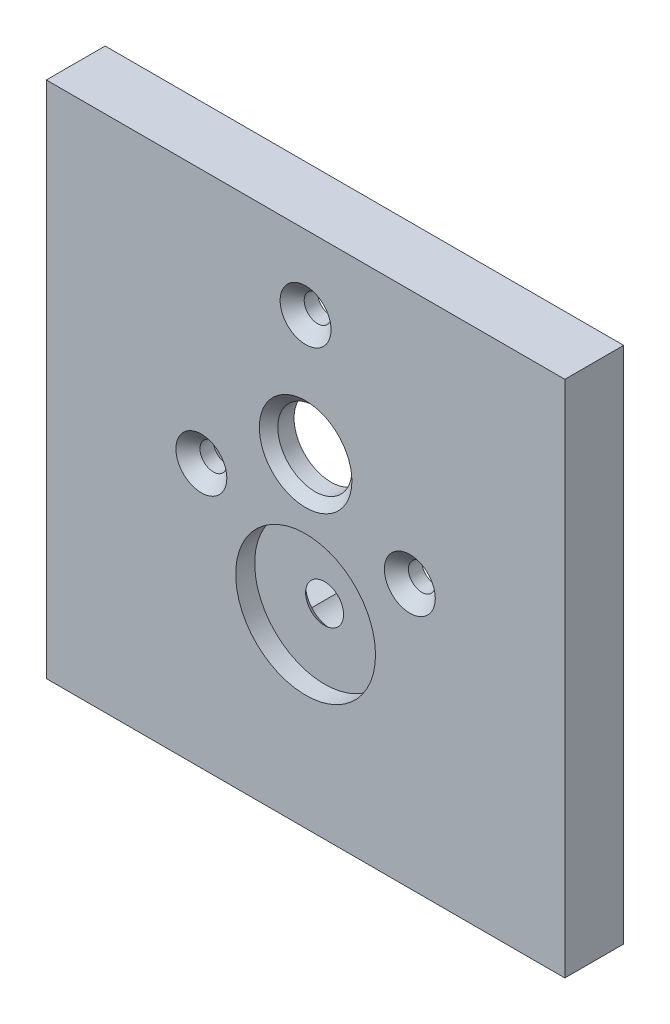
ISO-10303-21;
HEADER;
FILE_DESCRIPTION(('STEP AP214'),'2;1');
FILE_NAME('part.step','',(''),(''),'','','');
FILE_SCHEMA(('AUTOMOTIVE_DESIGN { 1 0 10303 214 1 1 1 1 }'));
ENDSEC;
DATA;
#1=APPLICATION_CONTEXT('core data for automotive mechanical design processes');
#2=APPLICATION_PROTOCOL_DEFINITION('international standard','automotive_design',2000,#1);
#3=PRODUCT_CONTEXT('',#1,'mechanical');
#4=PRODUCT('Part','Part','',(#3));
#5=PRODUCT_RELATED_PRODUCT_CATEGORY('part','',(#4));
#6=PRODUCT_DEFINITION_FORMATION('','',#4);
#7=PRODUCT_DEFINITION_CONTEXT('part definition',#1,'design');
#8=PRODUCT_DEFINITION('design','',#6,#7);
#9=PRODUCT_DEFINITION_SHAPE('','',#8);
#10=(LENGTH_UNIT() NAMED_UNIT(*) SI_UNIT(.MILLI.,.METRE.));
#11=(NAMED_UNIT(*) PLANE_ANGLE_UNIT() SI_UNIT($,.RADIAN.));
#12=(NAMED_UNIT(*) SI_UNIT($,.STERADIAN.) SOLID_ANGLE_UNIT());
#13=UNCERTAINTY_MEASURE_WITH_UNIT(LENGTH_MEASURE(1.E-05),#10,'distance_accuracy_value','');
#14=(GEOMETRIC_REPRESENTATION_CONTEXT(3) GLOBAL_UNCERTAINTY_ASSIGNED_CONTEXT((#13)) GLOBAL_UNIT_ASSIGNED_CONTEXT((#10,
#11,#12)) REPRESENTATION_CONTEXT('',''));
#15=CARTESIAN_POINT('',(0.,0.,0.));
#16=DIRECTION('',(0.,0.,1.));
#17=DIRECTION('',(1.,0.,0.));
#18=AXIS2_PLACEMENT_3D('',#15,#16,#17);
#19=CARTESIAN_POINT('',(0.,35.,3.6));
#20=DIRECTION('',(0.,0.,-1.));
#21=DIRECTION('',(-1.,0.,0.));
#22=AXIS2_PLACEMENT_3D('',#19,#20,#21);
#23=CYLINDRICAL_SURFACE('',#22,17.115);
#24=DIRECTION('',(0.,0.,1.));
#25=VECTOR('',#24,1.);
#26=CARTESIAN_POINT('',(-2.26765996755328,18.0358925,1.8));
#27=LINE('',#26,#25);
#28=CARTESIAN_POINT('',(-2.26765996755329,18.0358925,0.));
#29=VERTEX_POINT('',#28);
#30=CARTESIAN_POINT('',(-2.26765996755329,18.0358925,3.6));
#31=VERTEX_POINT('',#30);
#32=EDGE_CURVE('E11',#29,#31,#27,.T.);
#33=ORIENTED_EDGE('',*,*,#32,.F.);
#34=CARTESIAN_POINT('',(0.,35.,0.));
#35=DIRECTION('',(0.,0.,-1.));
#36=DIRECTION('',(-1.,0.,0.));
#37=AXIS2_PLACEMENT_3D('',#34,#35,#36);
#38=CIRCLE('',#37,17.115);
#39=CARTESIAN_POINT('',(2.26765996755329,18.0358925,0.));
#40=VERTEX_POINT('',#39);
#41=EDGE_CURVE('E172',#29,#40,#38,.T.);
#42=ORIENTED_EDGE('',*,*,#41,.T.);
#43=DIRECTION('',(0.,0.,1.));
#44=VECTOR('',#43,1.);
#45=CARTESIAN_POINT('',(2.26765996755328,18.0358925,1.8));
#46=LINE('',#45,#44);
#47=CARTESIAN_POINT('',(2.26765996755329,18.0358925,3.6));
#48=VERTEX_POINT('',#47);
#49=EDGE_CURVE('E50',#48,#40,#46,.F.);
#50=ORIENTED_EDGE('',*,*,#49,.F.);
#51=CARTESIAN_POINT('',(0.,35.,3.6));
#52=DIRECTION('',(0.,0.,-1.));
#53=DIRECTION('',(-1.,0.,0.));
#54=AXIS2_PLACEMENT_3D('',#51,#52,#53);
#55=CIRCLE('',#54,17.115);
#56=EDGE_CURVE('E173',#31,#48,#55,.T.);
#57=ORIENTED_EDGE('',*,*,#56,.F.);
#58=EDGE_LOOP('',(#33,#42,#50,#57));
#59=FACE_BOUND('',#58,.T.);
#60=ADVANCED_FACE('F40',(#59),#23,.F.);
#61=CARTESIAN_POINT('',(0.,35.,3.6));
#62=DIRECTION('',(0.,0.,-1.));
#63=DIRECTION('',(-1.,0.,0.));
#64=AXIS2_PLACEMENT_3D('',#61,#62,#63);
#65=PLANE('',#64);
#66=ORIENTED_EDGE('',*,*,#56,.T.);
#67=CARTESIAN_POINT('',(0.,20.,3.6));
#68=DIRECTION('',(0.,0.,-1.));
#69=DIRECTION('',(-1.,0.,0.));
#70=AXIS2_PLACEMENT_3D('',#67,#68,#69);
#71=CIRCLE('',#70,3.);
#72=EDGE_CURVE('E128',#48,#31,#71,.T.);
#73=ORIENTED_EDGE('',*,*,#72,.T.);
#74=EDGE_LOOP('',(#66,#73));
#75=FACE_BOUND('',#74,.T.);
#76=CARTESIAN_POINT('',(0.,35.,3.6));
#77=DIRECTION('',(0.,0.,-1.));
#78=DIRECTION('',(-1.,0.,0.));
#79=AXIS2_PLACEMENT_3D('',#76,#77,#78);
#80=CIRCLE('',#79,4.00000000000001);
#81=CARTESIAN_POINT('',(-4.00000000000001,35.,3.6));
#82=VERTEX_POINT('',#81);
#83=EDGE_CURVE('E164',#82,#82,#80,.T.);
#84=ORIENTED_EDGE('',*,*,#83,.F.);
#85=EDGE_LOOP('',(#84));
#86=FACE_BOUND('',#85,.T.);
#87=CARTESIAN_POINT('',(-11.2583302491978,28.5,3.6));
#88=DIRECTION('',(0.,0.,-1.));
#89=DIRECTION('',(-1.,0.,0.));
#90=AXIS2_PLACEMENT_3D('',#87,#88,#89);
#91=CIRCLE('',#90,1.44999999999999);
#92=CARTESIAN_POINT('',(-12.7083302491978,28.5,3.6));
#93=VERTEX_POINT('',#92);
#94=EDGE_CURVE('E165',#93,#93,#91,.F.);
#95=ORIENTED_EDGE('',*,*,#94,.T.);
#96=EDGE_LOOP('',(#95));
#97=FACE_BOUND('',#96,.T.);
#98=CARTESIAN_POINT('',(11.2583302491976,28.4999999999999,3.6));
#99=DIRECTION('',(0.,0.,-1.));
#100=DIRECTION('',(-1.,0.,0.));
#101=AXIS2_PLACEMENT_3D('',#98,#99,#100);
#102=CIRCLE('',#101,1.44999999999999);
#103=CARTESIAN_POINT('',(9.80833024919764,28.4999999999999,3.6));
#104=VERTEX_POINT('',#103);
#105=EDGE_CURVE('E156',#104,#104,#102,.F.);
#106=ORIENTED_EDGE('',*,*,#105,.T.);
#107=EDGE_LOOP('',(#106));
#108=FACE_BOUND('',#107,.T.);
#109=CARTESIAN_POINT('',(0.,48.,3.6));
#110=DIRECTION('',(0.,0.,-1.));
#111=DIRECTION('',(-1.,0.,0.));
#112=AXIS2_PLACEMENT_3D('',#109,#110,#111);
#113=CIRCLE('',#112,1.44999999999999);
#114=CARTESIAN_POINT('',(-1.44999999999999,48.,3.6));
#115=VERTEX_POINT('',#114);
#116=EDGE_CURVE('E147',#115,#115,#113,.F.);
#117=ORIENTED_EDGE('',*,*,#116,.T.);
#118=EDGE_LOOP('',(#117));
#119=FACE_BOUND('',#118,.T.);
#120=CARTESIAN_POINT('',(0.,20.,3.6));
#121=DIRECTION('',(0.,0.,-1.));
#122=DIRECTION('',(-1.,0.,0.));
#123=AXIS2_PLACEMENT_3D('',#120,#121,#122);
#124=CIRCLE('',#123,2.75);
#125=CARTESIAN_POINT('',(-2.75,20.,3.6));
#126=VERTEX_POINT('',#125);
#127=EDGE_CURVE('E127',#126,#126,#124,.T.);
#128=ORIENTED_EDGE('',*,*,#127,.F.);
#129=EDGE_LOOP('',(#128));
#130=FACE_BOUND('',#129,.T.);
#131=ADVANCED_FACE('F227',(#75,#86,#97,#108,#119,#130),#65,.T.);
#132=CARTESIAN_POINT('',(28.,0.,6.35));
#133=DIRECTION('',(-1.,0.,0.));
#134=DIRECTION('',(0.,0.,1.));
#135=AXIS2_PLACEMENT_3D('',#132,#133,#134);
#136=PLANE('',#135);
#137=DIRECTION('',(0.,1.,0.));
#138=VECTOR('',#137,1.);
#139=CARTESIAN_POINT('',(28.,0.,0.));
#140=LINE('',#139,#138);
#141=CARTESIAN_POINT('',(28.,0.,0.));
#142=VERTEX_POINT('',#141);
#143=CARTESIAN_POINT('',(28.,56.,0.));
#144=VERTEX_POINT('',#143);
#145=EDGE_CURVE('E176',#142,#144,#140,.T.);
#146=ORIENTED_EDGE('',*,*,#145,.T.);
#147=DIRECTION('',(0.,0.,-1.));
#148=VECTOR('',#147,1.);
#149=CARTESIAN_POINT('',(28.,56.,6.35));
#150=LINE('',#149,#148);
#151=CARTESIAN_POINT('',(28.,56.,6.35));
#152=VERTEX_POINT('',#151);
#153=EDGE_CURVE('E197',#152,#144,#150,.T.);
#154=ORIENTED_EDGE('',*,*,#153,.F.);
#155=DIRECTION('',(0.,1.,0.));
#156=VECTOR('',#155,1.);
#157=CARTESIAN_POINT('',(28.,0.,6.35));
#158=LINE('',#157,#156);
#159=CARTESIAN_POINT('',(28.,0.,6.35));
#160=VERTEX_POINT('',#159);
#161=EDGE_CURVE('E179',#160,#152,#158,.T.);
#162=ORIENTED_EDGE('',*,*,#161,.F.);
#163=DIRECTION('',(0.,0.,-1.));
#164=VECTOR('',#163,1.);
#165=CARTESIAN_POINT('',(28.,0.,6.35));
#166=LINE('',#165,#164);
#167=EDGE_CURVE('E185',#160,#142,#166,.T.);
#168=ORIENTED_EDGE('',*,*,#167,.T.);
#169=EDGE_LOOP('',(#146,#154,#162,#168));
#170=FACE_BOUND('',#169,.T.);
#171=ADVANCED_FACE('F233',(#170),#136,.F.);
#172=CARTESIAN_POINT('',(28.,56.,6.35));
#173=DIRECTION('',(0.,-1.,0.));
#174=DIRECTION('',(1.,0.,0.));
#175=AXIS2_PLACEMENT_3D('',#172,#173,#174);
#176=PLANE('',#175);
#177=DIRECTION('',(-1.,0.,0.));
#178=VECTOR('',#177,1.);
#179=CARTESIAN_POINT('',(28.,56.,0.));
#180=LINE('',#179,#178);
#181=CARTESIAN_POINT('',(-28.,56.,0.));
#182=VERTEX_POINT('',#181);
#183=EDGE_CURVE('E188',#144,#182,#180,.T.);
#184=ORIENTED_EDGE('',*,*,#183,.T.);
#185=DIRECTION('',(0.,0.,-1.));
#186=VECTOR('',#185,1.);
#187=CARTESIAN_POINT('',(-28.,56.,6.35));
#188=LINE('',#187,#186);
#189=CARTESIAN_POINT('',(-28.,56.,6.35));
#190=VERTEX_POINT('',#189);
#191=EDGE_CURVE('E195',#190,#182,#188,.T.);
#192=ORIENTED_EDGE('',*,*,#191,.F.);
#193=DIRECTION('',(-1.,0.,0.));
#194=VECTOR('',#193,1.);
#195=CARTESIAN_POINT('',(28.,56.,6.35));
#196=LINE('',#195,#194);
#197=EDGE_CURVE('E91',#152,#190,#196,.T.);
#198=ORIENTED_EDGE('',*,*,#197,.F.);
#199=ORIENTED_EDGE('',*,*,#153,.T.);
#200=EDGE_LOOP('',(#184,#192,#198,#199));
#201=FACE_BOUND('',#200,.T.);
#202=ADVANCED_FACE('F254',(#201),#176,.F.);
#203=CARTESIAN_POINT('',(-28.,56.,6.35));
#204=DIRECTION('',(1.,0.,0.));
#205=DIRECTION('',(0.,0.,-1.));
#206=AXIS2_PLACEMENT_3D('',#203,#204,#205);
#207=PLANE('',#206);
#208=DIRECTION('',(0.,-1.,0.));
#209=VECTOR('',#208,1.);
#210=CARTESIAN_POINT('',(-28.,56.,0.));
#211=LINE('',#210,#209);
#212=CARTESIAN_POINT('',(-28.,0.,0.));
#213=VERTEX_POINT('',#212);
#214=EDGE_CURVE('E77',#182,#213,#211,.T.);
#215=ORIENTED_EDGE('',*,*,#214,.T.);
#216=DIRECTION('',(0.,0.,-1.));
#217=VECTOR('',#216,1.);
#218=CARTESIAN_POINT('',(-28.,0.,6.35));
#219=LINE('',#218,#217);
#220=CARTESIAN_POINT('',(-28.,0.,6.35));
#221=VERTEX_POINT('',#220);
#222=EDGE_CURVE('E193',#221,#213,#219,.T.);
#223=ORIENTED_EDGE('',*,*,#222,.F.);
#224=DIRECTION('',(0.,-1.,0.));
#225=VECTOR('',#224,1.);
#226=CARTESIAN_POINT('',(-28.,56.,6.35));
#227=LINE('',#226,#225);
#228=EDGE_CURVE('E182',#190,#221,#227,.T.);
#229=ORIENTED_EDGE('',*,*,#228,.F.);
#230=ORIENTED_EDGE('',*,*,#191,.T.);
#231=EDGE_LOOP('',(#215,#223,#229,#230));
#232=FACE_BOUND('',#231,.T.);
#233=ADVANCED_FACE('F250',(#232),#207,.F.);
#234=CARTESIAN_POINT('',(-28.,0.,6.35));
#235=DIRECTION('',(0.,1.,0.));
#236=DIRECTION('',(0.,0.,1.));
#237=AXIS2_PLACEMENT_3D('',#234,#235,#236);
#238=PLANE('',#237);
#239=CARTESIAN_POINT('',(-24.825,0.,3.17500000000003));
#240=DIRECTION('',(0.,1.,0.));
#241=DIRECTION('',(0.,0.,1.));
#242=AXIS2_PLACEMENT_3D('',#239,#240,#241);
#243=CIRCLE('',#242,1.45);
#244=CARTESIAN_POINT('',(-24.825,0.,4.62500000000002));
#245=VERTEX_POINT('',#244);
#246=EDGE_CURVE('E44',#245,#245,#243,.T.);
#247=ORIENTED_EDGE('',*,*,#246,.T.);
#248=EDGE_LOOP('',(#247));
#249=FACE_BOUND('',#248,.T.);
#250=CARTESIAN_POINT('',(24.8249999999999,0.,3.17500000000004));
#251=DIRECTION('',(0.,1.,0.));
#252=DIRECTION('',(0.,0.,1.));
#253=AXIS2_PLACEMENT_3D('',#250,#251,#252);
#254=CIRCLE('',#253,1.45);
#255=CARTESIAN_POINT('',(24.8249999999999,0.,4.62500000000004));
#256=VERTEX_POINT('',#255);
#257=EDGE_CURVE('E124',#256,#256,#254,.T.);
#258=ORIENTED_EDGE('',*,*,#257,.T.);
#259=EDGE_LOOP('',(#258));
#260=FACE_BOUND('',#259,.T.);
#261=DIRECTION('',(1.,0.,0.));
#262=VECTOR('',#261,1.);
#263=CARTESIAN_POINT('',(-28.,0.,0.));
#264=LINE('',#263,#262);
#265=EDGE_CURVE('E83',#213,#142,#264,.T.);
#266=ORIENTED_EDGE('',*,*,#265,.T.);
#267=ORIENTED_EDGE('',*,*,#167,.F.);
#268=DIRECTION('',(1.,0.,0.));
#269=VECTOR('',#268,1.);
#270=CARTESIAN_POINT('',(-28.,0.,6.35));
#271=LINE('',#270,#269);
#272=EDGE_CURVE('E59',#221,#160,#271,.T.);
#273=ORIENTED_EDGE('',*,*,#272,.F.);
#274=ORIENTED_EDGE('',*,*,#222,.T.);
#275=EDGE_LOOP('',(#266,#267,#273,#274));
#276=FACE_BOUND('',#275,.T.);
#277=ADVANCED_FACE('F208',(#249,#260,#276),#238,.F.);
#278=CARTESIAN_POINT('',(28.,56.,6.35));
#279=DIRECTION('',(0.,0.,1.));
#280=DIRECTION('',(1.,0.,0.));
#281=AXIS2_PLACEMENT_3D('',#278,#279,#280);
#282=PLANE('',#281);
#283=CARTESIAN_POINT('',(0.,20.,6.35));
#284=DIRECTION('',(0.,0.,1.));
#285=DIRECTION('',(1.,0.,0.));
#286=AXIS2_PLACEMENT_3D('',#283,#284,#285);
#287=CIRCLE('',#286,7.55);
#288=CARTESIAN_POINT('',(7.55,20.,6.35));
#289=VERTEX_POINT('',#288);
#290=EDGE_CURVE('E136',#289,#289,#287,.T.);
#291=ORIENTED_EDGE('',*,*,#290,.F.);
#292=EDGE_LOOP('',(#291));
#293=FACE_BOUND('',#292,.T.);
#294=CARTESIAN_POINT('',(0.,35.,6.35));
#295=DIRECTION('',(0.,0.,1.));
#296=DIRECTION('',(1.,0.,0.));
#297=AXIS2_PLACEMENT_3D('',#294,#295,#296);
#298=CIRCLE('',#297,5.00000000000002);
#299=CARTESIAN_POINT('',(5.00000000000003,35.,6.35));
#300=VERTEX_POINT('',#299);
#301=EDGE_CURVE('E199',#300,#300,#298,.F.);
#302=ORIENTED_EDGE('',*,*,#301,.T.);
#303=EDGE_LOOP('',(#302));
#304=FACE_BOUND('',#303,.T.);
#305=CARTESIAN_POINT('',(0.,48.,6.35));
#306=DIRECTION('',(0.,0.,1.));
#307=DIRECTION('',(1.,0.,0.));
#308=AXIS2_PLACEMENT_3D('',#305,#306,#307);
#309=CIRCLE('',#308,2.75);
#310=CARTESIAN_POINT('',(2.75,48.,6.35));
#311=VERTEX_POINT('',#310);
#312=EDGE_CURVE('E140',#311,#311,#309,.T.);
#313=ORIENTED_EDGE('',*,*,#312,.F.);
#314=EDGE_LOOP('',(#313));
#315=FACE_BOUND('',#314,.T.);
#316=CARTESIAN_POINT('',(11.2583302491976,28.4999999999999,6.35));
#317=DIRECTION('',(0.,0.,1.));
#318=DIRECTION('',(1.,0.,0.));
#319=AXIS2_PLACEMENT_3D('',#316,#317,#318);
#320=CIRCLE('',#319,2.75);
#321=CARTESIAN_POINT('',(14.0083302491976,28.4999999999999,6.35));
#322=VERTEX_POINT('',#321);
#323=EDGE_CURVE('E146',#322,#322,#320,.T.);
#324=ORIENTED_EDGE('',*,*,#323,.F.);
#325=EDGE_LOOP('',(#324));
#326=FACE_BOUND('',#325,.T.);
#327=CARTESIAN_POINT('',(-11.2583302491978,28.5,6.35));
#328=DIRECTION('',(0.,0.,1.));
#329=DIRECTION('',(1.,0.,0.));
#330=AXIS2_PLACEMENT_3D('',#327,#328,#329);
#331=CIRCLE('',#330,2.75);
#332=CARTESIAN_POINT('',(-8.50833024919785,28.5,6.35));
#333=VERTEX_POINT('',#332);
#334=EDGE_CURVE('E155',#333,#333,#331,.T.);
#335=ORIENTED_EDGE('',*,*,#334,.F.);
#336=EDGE_LOOP('',(#335));
#337=FACE_BOUND('',#336,.T.);
#338=ORIENTED_EDGE('',*,*,#161,.T.);
#339=ORIENTED_EDGE('',*,*,#197,.T.);
#340=ORIENTED_EDGE('',*,*,#228,.T.);
#341=ORIENTED_EDGE('',*,*,#272,.T.);
#342=EDGE_LOOP('',(#338,#339,#340,#341));
#343=FACE_BOUND('',#342,.T.);
#344=ADVANCED_FACE('F239',(#293,#304,#315,#326,#337,#343),#282,.T.);
#345=CARTESIAN_POINT('',(28.,56.,0.));
#346=DIRECTION('',(0.,0.,1.));
#347=DIRECTION('',(1.,0.,0.));
#348=AXIS2_PLACEMENT_3D('',#345,#346,#347);
#349=PLANE('',#348);
#350=CARTESIAN_POINT('',(0.,20.,0.));
#351=DIRECTION('',(0.,0.,-1.));
#352=DIRECTION('',(-1.,0.,0.));
#353=AXIS2_PLACEMENT_3D('',#350,#351,#352);
#354=CIRCLE('',#353,3.);
#355=EDGE_CURVE('E125',#40,#29,#354,.T.);
#356=ORIENTED_EDGE('',*,*,#355,.F.);
#357=ORIENTED_EDGE('',*,*,#41,.F.);
#358=EDGE_LOOP('',(#356,#357));
#359=FACE_BOUND('',#358,.T.);
#360=ORIENTED_EDGE('',*,*,#145,.F.);
#361=ORIENTED_EDGE('',*,*,#265,.F.);
#362=ORIENTED_EDGE('',*,*,#214,.F.);
#363=ORIENTED_EDGE('',*,*,#183,.F.);
#364=EDGE_LOOP('',(#360,#361,#362,#363));
#365=FACE_BOUND('',#364,.T.);
#366=ADVANCED_FACE('F242',(#359,#365),#349,.F.);
#367=CARTESIAN_POINT('',(0.,35.,6.35));
#368=DIRECTION('',(0.,0.,-1.));
#369=DIRECTION('',(-1.,0.,0.));
#370=AXIS2_PLACEMENT_3D('',#367,#368,#369);
#371=CYLINDRICAL_SURFACE('',#370,4.00000000000001);
#372=CARTESIAN_POINT('',(0.,35.,5.34999999999998));
#373=DIRECTION('',(0.,0.,1.));
#374=DIRECTION('',(1.,0.,0.));
#375=AXIS2_PLACEMENT_3D('',#372,#373,#374);
#376=CIRCLE('',#375,4.00000000000001);
#377=CARTESIAN_POINT('',(4.00000000000001,35.,5.34999999999998));
#378=VERTEX_POINT('',#377);
#379=EDGE_CURVE('E202',#378,#378,#376,.T.);
#380=ORIENTED_EDGE('',*,*,#379,.T.);
#381=EDGE_LOOP('',(#380));
#382=FACE_BOUND('',#381,.T.);
#383=ORIENTED_EDGE('',*,*,#83,.T.);
#384=EDGE_LOOP('',(#383));
#385=FACE_BOUND('',#384,.T.);
#386=ADVANCED_FACE('F246',(#382,#385),#371,.F.);
#387=CARTESIAN_POINT('',(-11.2583302491978,28.5,6.35));
#388=DIRECTION('',(0.,0.,1.));
#389=DIRECTION('',(1.,0.,0.));
#390=AXIS2_PLACEMENT_3D('',#387,#388,#389);
#391=CYLINDRICAL_SURFACE('',#390,1.44999999999999);
#392=ORIENTED_EDGE('',*,*,#94,.F.);
#393=EDGE_LOOP('',(#392));
#394=FACE_BOUND('',#393,.T.);
#395=CARTESIAN_POINT('',(-11.2583302491978,28.5,5.04999999999999));
#396=DIRECTION('',(0.,0.,1.));
#397=DIRECTION('',(1.,0.,0.));
#398=AXIS2_PLACEMENT_3D('',#395,#396,#397);
#399=CIRCLE('',#398,1.44999999999999);
#400=CARTESIAN_POINT('',(-9.80833024919786,28.5,5.04999999999999));
#401=VERTEX_POINT('',#400);
#402=EDGE_CURVE('E161',#401,#401,#399,.T.);
#403=ORIENTED_EDGE('',*,*,#402,.T.);
#404=EDGE_LOOP('',(#403));
#405=FACE_BOUND('',#404,.T.);
#406=ADVANCED_FACE('F300',(#394,#405),#391,.F.);
#407=CARTESIAN_POINT('',(-11.2583302491978,28.5,6.35));
#408=DIRECTION('',(0.,0.,1.));
#409=DIRECTION('',(1.,0.,0.));
#410=AXIS2_PLACEMENT_3D('',#407,#408,#409);
#411=CONICAL_SURFACE('',#410,2.75,0.785398163397448);
#412=ORIENTED_EDGE('',*,*,#402,.F.);
#413=EDGE_LOOP('',(#412));
#414=FACE_BOUND('',#413,.T.);
#415=ORIENTED_EDGE('',*,*,#334,.T.);
#416=EDGE_LOOP('',(#415));
#417=FACE_BOUND('',#416,.T.);
#418=ADVANCED_FACE('F307',(#414,#417),#411,.F.);
#419=CARTESIAN_POINT('',(11.2583302491976,28.4999999999999,6.35));
#420=DIRECTION('',(0.,0.,1.));
#421=DIRECTION('',(1.,0.,0.));
#422=AXIS2_PLACEMENT_3D('',#419,#420,#421);
#423=CYLINDRICAL_SURFACE('',#422,1.44999999999999);
#424=ORIENTED_EDGE('',*,*,#105,.F.);
#425=EDGE_LOOP('',(#424));
#426=FACE_BOUND('',#425,.T.);
#427=CARTESIAN_POINT('',(11.2583302491976,28.4999999999999,5.04999999999999));
#428=DIRECTION('',(0.,0.,1.));
#429=DIRECTION('',(1.,0.,0.));
#430=AXIS2_PLACEMENT_3D('',#427,#428,#429);
#431=CIRCLE('',#430,1.44999999999999);
#432=CARTESIAN_POINT('',(12.7083302491976,28.4999999999999,5.04999999999999));
#433=VERTEX_POINT('',#432);
#434=EDGE_CURVE('E152',#433,#433,#431,.T.);
#435=ORIENTED_EDGE('',*,*,#434,.T.);
#436=EDGE_LOOP('',(#435));
#437=FACE_BOUND('',#436,.T.);
#438=ADVANCED_FACE('F315',(#426,#437),#423,.F.);
#439=CARTESIAN_POINT('',(11.2583302491976,28.4999999999999,6.35));
#440=DIRECTION('',(0.,0.,1.));
#441=DIRECTION('',(1.,0.,0.));
#442=AXIS2_PLACEMENT_3D('',#439,#440,#441);
#443=CONICAL_SURFACE('',#442,2.75,0.785398163397448);
#444=ORIENTED_EDGE('',*,*,#434,.F.);
#445=EDGE_LOOP('',(#444));
#446=FACE_BOUND('',#445,.T.);
#447=ORIENTED_EDGE('',*,*,#323,.T.);
#448=EDGE_LOOP('',(#447));
#449=FACE_BOUND('',#448,.T.);
#450=ADVANCED_FACE('F323',(#446,#449),#443,.F.);
#451=CARTESIAN_POINT('',(0.,48.,6.35));
#452=DIRECTION('',(0.,0.,1.));
#453=DIRECTION('',(1.,0.,0.));
#454=AXIS2_PLACEMENT_3D('',#451,#452,#453);
#455=CYLINDRICAL_SURFACE('',#454,1.44999999999999);
#456=ORIENTED_EDGE('',*,*,#116,.F.);
#457=EDGE_LOOP('',(#456));
#458=FACE_BOUND('',#457,.T.);
#459=CARTESIAN_POINT('',(0.,48.,5.04999999999999));
#460=DIRECTION('',(0.,0.,1.));
#461=DIRECTION('',(1.,0.,0.));
#462=AXIS2_PLACEMENT_3D('',#459,#460,#461);
#463=CIRCLE('',#462,1.44999999999999);
#464=CARTESIAN_POINT('',(1.44999999999999,48.,5.04999999999999));
#465=VERTEX_POINT('',#464);
#466=EDGE_CURVE('E143',#465,#465,#463,.T.);
#467=ORIENTED_EDGE('',*,*,#466,.T.);
#468=EDGE_LOOP('',(#467));
#469=FACE_BOUND('',#468,.T.);
#470=ADVANCED_FACE('F331',(#458,#469),#455,.F.);
#471=CARTESIAN_POINT('',(0.,48.,6.35));
#472=DIRECTION('',(0.,0.,1.));
#473=DIRECTION('',(1.,0.,0.));
#474=AXIS2_PLACEMENT_3D('',#471,#472,#473);
#475=CONICAL_SURFACE('',#474,2.75,0.785398163397448);
#476=ORIENTED_EDGE('',*,*,#466,.F.);
#477=EDGE_LOOP('',(#476));
#478=FACE_BOUND('',#477,.T.);
#479=ORIENTED_EDGE('',*,*,#312,.T.);
#480=EDGE_LOOP('',(#479));
#481=FACE_BOUND('',#480,.T.);
#482=ADVANCED_FACE('F339',(#478,#481),#475,.F.);
#483=CARTESIAN_POINT('',(0.,35.,6.35));
#484=DIRECTION('',(0.,0.,1.));
#485=DIRECTION('',(1.,0.,0.));
#486=AXIS2_PLACEMENT_3D('',#483,#484,#485);
#487=CONICAL_SURFACE('',#486,5.00000000000002,0.785398163397445);
#488=ORIENTED_EDGE('',*,*,#379,.F.);
#489=EDGE_LOOP('',(#488));
#490=FACE_BOUND('',#489,.T.);
#491=ORIENTED_EDGE('',*,*,#301,.F.);
#492=EDGE_LOOP('',(#491));
#493=FACE_BOUND('',#492,.T.);
#494=ADVANCED_FACE('F42',(#490,#493),#487,.F.);
#495=CARTESIAN_POINT('',(0.,20.,4.3));
#496=DIRECTION('',(0.,0.,1.));
#497=DIRECTION('',(1.,0.,0.));
#498=AXIS2_PLACEMENT_3D('',#495,#496,#497);
#499=CYLINDRICAL_SURFACE('',#498,7.55);
#500=CARTESIAN_POINT('',(0.,20.,4.3));
#501=DIRECTION('',(0.,0.,1.));
#502=DIRECTION('',(1.,0.,0.));
#503=AXIS2_PLACEMENT_3D('',#500,#501,#502);
#504=CIRCLE('',#503,7.55);
#505=CARTESIAN_POINT('',(7.55,20.,4.3));
#506=VERTEX_POINT('',#505);
#507=EDGE_CURVE('E137',#506,#506,#504,.T.);
#508=ORIENTED_EDGE('',*,*,#507,.F.);
#509=EDGE_LOOP('',(#508));
#510=FACE_BOUND('',#509,.T.);
#511=ORIENTED_EDGE('',*,*,#290,.T.);
#512=EDGE_LOOP('',(#511));
#513=FACE_BOUND('',#512,.T.);
#514=ADVANCED_FACE('F352',(#510,#513),#499,.F.);
#515=CARTESIAN_POINT('',(0.,20.,4.3));
#516=DIRECTION('',(0.,0.,1.));
#517=DIRECTION('',(1.,0.,0.));
#518=AXIS2_PLACEMENT_3D('',#515,#516,#517);
#519=PLANE('',#518);
#520=CARTESIAN_POINT('',(0.,20.,4.3));
#521=DIRECTION('',(0.,0.,1.));
#522=DIRECTION('',(1.,0.,0.));
#523=AXIS2_PLACEMENT_3D('',#520,#521,#522);
#524=CIRCLE('',#523,2.05);
#525=CARTESIAN_POINT('',(2.05,20.,4.3));
#526=VERTEX_POINT('',#525);
#527=EDGE_CURVE('E133',#526,#526,#524,.T.);
#528=ORIENTED_EDGE('',*,*,#527,.F.);
#529=EDGE_LOOP('',(#528));
#530=FACE_BOUND('',#529,.T.);
#531=ORIENTED_EDGE('',*,*,#507,.T.);
#532=EDGE_LOOP('',(#531));
#533=FACE_BOUND('',#532,.T.);
#534=ADVANCED_FACE('F358',(#530,#533),#519,.T.);
#535=CARTESIAN_POINT('',(0.,20.,3.6));
#536=DIRECTION('',(0.,0.,-1.));
#537=DIRECTION('',(-1.,0.,0.));
#538=AXIS2_PLACEMENT_3D('',#535,#536,#537);
#539=CONICAL_SURFACE('',#538,2.75,0.785398163397448);
#540=ORIENTED_EDGE('',*,*,#527,.T.);
#541=EDGE_LOOP('',(#540));
#542=FACE_BOUND('',#541,.T.);
#543=ORIENTED_EDGE('',*,*,#127,.T.);
#544=EDGE_LOOP('',(#543));
#545=FACE_BOUND('',#544,.T.);
#546=ADVANCED_FACE('F222',(#542,#545),#539,.F.);
#547=CARTESIAN_POINT('',(0.,20.,0.));
#548=DIRECTION('',(0.,0.,1.));
#549=DIRECTION('',(1.,0.,0.));
#550=AXIS2_PLACEMENT_3D('',#547,#548,#549);
#551=CYLINDRICAL_SURFACE('',#550,3.);
#552=ORIENTED_EDGE('',*,*,#32,.T.);
#553=ORIENTED_EDGE('',*,*,#72,.F.);
#554=ORIENTED_EDGE('',*,*,#49,.T.);
#555=ORIENTED_EDGE('',*,*,#355,.T.);
#556=EDGE_LOOP('',(#552,#553,#554,#555));
#557=FACE_BOUND('',#556,.T.);
#558=ADVANCED_FACE('F213',(#557),#551,.F.);
#559=CARTESIAN_POINT('',(24.8249999999999,-2.50000000000001,3.17500000000004));
#560=DIRECTION('',(0.,-1.,0.));
#561=DIRECTION('',(0.,0.,-1.));
#562=AXIS2_PLACEMENT_3D('',#559,#560,#561);
#563=CYLINDRICAL_SURFACE('',#562,1.45);
#564=CARTESIAN_POINT('',(24.8249999999999,7.49999999999999,3.17500000000004));
#565=DIRECTION('',(0.,-1.,0.));
#566=DIRECTION('',(0.,0.,-1.));
#567=AXIS2_PLACEMENT_3D('',#564,#565,#566);
#568=CIRCLE('',#567,1.45);
#569=CARTESIAN_POINT('',(24.8249999999999,7.49999999999999,1.72500000000004));
#570=VERTEX_POINT('',#569);
#571=EDGE_CURVE('E120',#570,#570,#568,.T.);
#572=ORIENTED_EDGE('',*,*,#571,.F.);
#573=EDGE_LOOP('',(#572));
#574=FACE_BOUND('',#573,.T.);
#575=ORIENTED_EDGE('',*,*,#257,.F.);
#576=EDGE_LOOP('',(#575));
#577=FACE_BOUND('',#576,.T.);
#578=ADVANCED_FACE('F210',(#574,#577),#563,.F.);
#579=CARTESIAN_POINT('',(24.8249999999999,7.49999999999999,3.17500000000004));
#580=DIRECTION('',(0.,-1.,0.));
#581=DIRECTION('',(0.,0.,-1.));
#582=AXIS2_PLACEMENT_3D('',#579,#580,#581);
#583=CONICAL_SURFACE('',#582,1.45,1.02974425867665);
#584=CARTESIAN_POINT('',(24.8249999999999,8.37124789758995,3.17500000000004));
#585=VERTEX_POINT('',#584);
#586=VERTEX_LOOP('',#585);
#587=FACE_BOUND('',#586,.T.);
#588=ORIENTED_EDGE('',*,*,#571,.T.);
#589=EDGE_LOOP('',(#588));
#590=FACE_BOUND('',#589,.T.);
#591=ADVANCED_FACE('F212',(#587,#590),#583,.F.);
#592=CARTESIAN_POINT('',(-24.825,-2.50000000000002,3.17500000000003));
#593=DIRECTION('',(0.,-1.,0.));
#594=DIRECTION('',(0.,0.,-1.));
#595=AXIS2_PLACEMENT_3D('',#592,#593,#594);
#596=CYLINDRICAL_SURFACE('',#595,1.45);
#597=CARTESIAN_POINT('',(-24.825,7.49999999999998,3.17500000000003));
#598=DIRECTION('',(0.,-1.,0.));
#599=DIRECTION('',(0.,0.,-1.));
#600=AXIS2_PLACEMENT_3D('',#597,#598,#599);
#601=CIRCLE('',#600,1.45);
#602=CARTESIAN_POINT('',(-24.825,7.49999999999998,1.72500000000003));
#603=VERTEX_POINT('',#602);
#604=EDGE_CURVE('E116',#603,#603,#601,.T.);
#605=ORIENTED_EDGE('',*,*,#604,.F.);
#606=EDGE_LOOP('',(#605));
#607=FACE_BOUND('',#606,.T.);
#608=ORIENTED_EDGE('',*,*,#246,.F.);
#609=EDGE_LOOP('',(#608));
#610=FACE_BOUND('',#609,.T.);
#611=ADVANCED_FACE('F112',(#607,#610),#596,.F.);
#612=CARTESIAN_POINT('',(-24.825,7.49999999999998,3.17500000000003));
#613=DIRECTION('',(0.,-1.,0.));
#614=DIRECTION('',(0.,0.,-1.));
#615=AXIS2_PLACEMENT_3D('',#612,#613,#614);
#616=CONICAL_SURFACE('',#615,1.45,1.02974425867665);
#617=CARTESIAN_POINT('',(-24.825,8.37124789758995,3.17500000000003));
#618=VERTEX_POINT('',#617);
#619=VERTEX_LOOP('',#618);
#620=FACE_BOUND('',#619,.T.);
#621=ORIENTED_EDGE('',*,*,#604,.T.);
#622=EDGE_LOOP('',(#621));
#623=FACE_BOUND('',#622,.T.);
#624=ADVANCED_FACE('F109',(#620,#623),#616,.F.);
#625=CLOSED_SHELL('',(#60,#131,#171,#202,#233,#277,#344,#366,#386,#406,#418,#438,#450,#470,#482,
#494,#514,#534,#546,#558,#578,#591,#611,#624));
#626=MANIFOLD_SOLID_BREP('B2',#625);
#627=ADVANCED_BREP_SHAPE_REPRESENTATION('',(#18,#626),#14);
#628=SHAPE_DEFINITION_REPRESENTATION(#9,#627);
ENDSEC;
END-ISO-10303-21;
